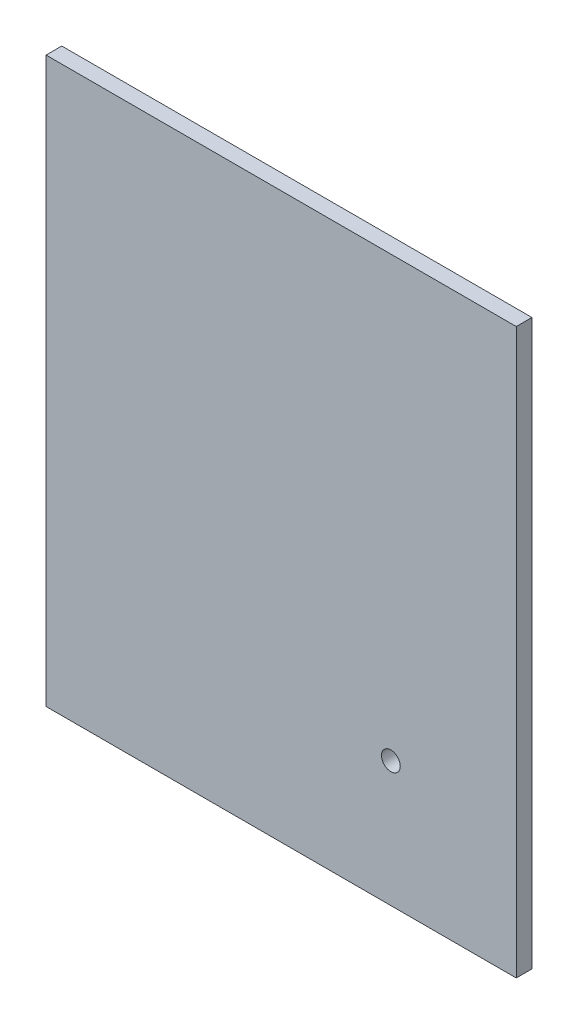
ISO-10303-21;
HEADER;
FILE_DESCRIPTION(('STEP AP214'),'2;1');
FILE_NAME('part.step','',(''),(''),'','','');
FILE_SCHEMA(('AUTOMOTIVE_DESIGN { 1 0 10303 214 1 1 1 1 }'));
ENDSEC;
DATA;
#1=APPLICATION_CONTEXT('core data for automotive mechanical design processes');
#2=APPLICATION_PROTOCOL_DEFINITION('international standard','automotive_design',2000,#1);
#3=PRODUCT_CONTEXT('',#1,'mechanical');
#4=PRODUCT('Part','Part','',(#3));
#5=PRODUCT_RELATED_PRODUCT_CATEGORY('part','',(#4));
#6=PRODUCT_DEFINITION_FORMATION('','',#4);
#7=PRODUCT_DEFINITION_CONTEXT('part definition',#1,'design');
#8=PRODUCT_DEFINITION('design','',#6,#7);
#9=PRODUCT_DEFINITION_SHAPE('','',#8);
#10=(LENGTH_UNIT() NAMED_UNIT(*) SI_UNIT(.MILLI.,.METRE.));
#11=(NAMED_UNIT(*) PLANE_ANGLE_UNIT() SI_UNIT($,.RADIAN.));
#12=(NAMED_UNIT(*) SI_UNIT($,.STERADIAN.) SOLID_ANGLE_UNIT());
#13=UNCERTAINTY_MEASURE_WITH_UNIT(LENGTH_MEASURE(1.E-05),#10,'distance_accuracy_value','');
#14=(GEOMETRIC_REPRESENTATION_CONTEXT(3) GLOBAL_UNCERTAINTY_ASSIGNED_CONTEXT((#13)) GLOBAL_UNIT_ASSIGNED_CONTEXT((#10,
#11,#12)) REPRESENTATION_CONTEXT('',''));
#15=CARTESIAN_POINT('',(0.,0.,0.));
#16=DIRECTION('',(0.,0.,1.));
#17=DIRECTION('',(1.,0.,0.));
#18=AXIS2_PLACEMENT_3D('',#15,#16,#17);
#19=CARTESIAN_POINT('',(0.,-90.,5.));
#20=DIRECTION('',(0.,-1.,0.));
#21=DIRECTION('',(1.,0.,0.));
#22=AXIS2_PLACEMENT_3D('',#19,#20,#21);
#23=PLANE('',#22);
#24=DIRECTION('',(-1.,0.,0.));
#25=VECTOR('',#24,1.);
#26=CARTESIAN_POINT('',(0.,-90.,0.));
#27=LINE('',#26,#25);
#28=CARTESIAN_POINT('',(75.,-90.,0.));
#29=VERTEX_POINT('',#28);
#30=CARTESIAN_POINT('',(-75.,-90.,0.));
#31=VERTEX_POINT('',#30);
#32=EDGE_CURVE('E102',#29,#31,#27,.T.);
#33=ORIENTED_EDGE('',*,*,#32,.F.);
#34=DIRECTION('',(0.,0.,-1.));
#35=VECTOR('',#34,1.);
#36=CARTESIAN_POINT('',(75.,-90.,5.));
#37=LINE('',#36,#35);
#38=CARTESIAN_POINT('',(75.,-90.,5.));
#39=VERTEX_POINT('',#38);
#40=EDGE_CURVE('E11',#39,#29,#37,.T.);
#41=ORIENTED_EDGE('',*,*,#40,.F.);
#42=DIRECTION('',(-1.,0.,0.));
#43=VECTOR('',#42,1.);
#44=CARTESIAN_POINT('',(0.,-90.,5.));
#45=LINE('',#44,#43);
#46=CARTESIAN_POINT('',(-75.,-90.,5.));
#47=VERTEX_POINT('',#46);
#48=EDGE_CURVE('E84',#39,#47,#45,.T.);
#49=ORIENTED_EDGE('',*,*,#48,.T.);
#50=DIRECTION('',(0.,0.,-1.));
#51=VECTOR('',#50,1.);
#52=CARTESIAN_POINT('',(-75.,-90.,5.));
#53=LINE('',#52,#51);
#54=EDGE_CURVE('E51',#47,#31,#53,.T.);
#55=ORIENTED_EDGE('',*,*,#54,.T.);
#56=EDGE_LOOP('',(#33,#41,#49,#55));
#57=FACE_BOUND('',#56,.T.);
#58=ADVANCED_FACE('F35',(#57),#23,.T.);
#59=CARTESIAN_POINT('',(75.,0.,5.));
#60=DIRECTION('',(-1.,0.,0.));
#61=DIRECTION('',(0.,0.,1.));
#62=AXIS2_PLACEMENT_3D('',#59,#60,#61);
#63=PLANE('',#62);
#64=DIRECTION('',(0.,1.,0.));
#65=VECTOR('',#64,1.);
#66=CARTESIAN_POINT('',(75.,0.,0.));
#67=LINE('',#66,#65);
#68=CARTESIAN_POINT('',(75.,90.,0.));
#69=VERTEX_POINT('',#68);
#70=EDGE_CURVE('E90',#29,#69,#67,.T.);
#71=ORIENTED_EDGE('',*,*,#70,.T.);
#72=DIRECTION('',(0.,0.,-1.));
#73=VECTOR('',#72,1.);
#74=CARTESIAN_POINT('',(75.,90.,5.));
#75=LINE('',#74,#73);
#76=CARTESIAN_POINT('',(75.,90.,5.));
#77=VERTEX_POINT('',#76);
#78=EDGE_CURVE('E43',#77,#69,#75,.T.);
#79=ORIENTED_EDGE('',*,*,#78,.F.);
#80=DIRECTION('',(0.,1.,0.));
#81=VECTOR('',#80,1.);
#82=CARTESIAN_POINT('',(75.,0.,5.));
#83=LINE('',#82,#81);
#84=EDGE_CURVE('E77',#39,#77,#83,.T.);
#85=ORIENTED_EDGE('',*,*,#84,.F.);
#86=ORIENTED_EDGE('',*,*,#40,.T.);
#87=EDGE_LOOP('',(#71,#79,#85,#86));
#88=FACE_BOUND('',#87,.T.);
#89=ADVANCED_FACE('F88',(#88),#63,.F.);
#90=CARTESIAN_POINT('',(0.,90.,5.));
#91=DIRECTION('',(0.,-1.,0.));
#92=DIRECTION('',(1.,0.,0.));
#93=AXIS2_PLACEMENT_3D('',#90,#91,#92);
#94=PLANE('',#93);
#95=DIRECTION('',(-1.,0.,0.));
#96=VECTOR('',#95,1.);
#97=CARTESIAN_POINT('',(0.,90.,0.));
#98=LINE('',#97,#96);
#99=CARTESIAN_POINT('',(-75.,90.,0.));
#100=VERTEX_POINT('',#99);
#101=EDGE_CURVE('E105',#69,#100,#98,.T.);
#102=ORIENTED_EDGE('',*,*,#101,.T.);
#103=DIRECTION('',(0.,0.,-1.));
#104=VECTOR('',#103,1.);
#105=CARTESIAN_POINT('',(-75.,90.,5.));
#106=LINE('',#105,#104);
#107=CARTESIAN_POINT('',(-75.,90.,5.));
#108=VERTEX_POINT('',#107);
#109=EDGE_CURVE('E65',#108,#100,#106,.T.);
#110=ORIENTED_EDGE('',*,*,#109,.F.);
#111=DIRECTION('',(-1.,0.,0.));
#112=VECTOR('',#111,1.);
#113=CARTESIAN_POINT('',(0.,90.,5.));
#114=LINE('',#113,#112);
#115=EDGE_CURVE('E83',#77,#108,#114,.T.);
#116=ORIENTED_EDGE('',*,*,#115,.F.);
#117=ORIENTED_EDGE('',*,*,#78,.T.);
#118=EDGE_LOOP('',(#102,#110,#116,#117));
#119=FACE_BOUND('',#118,.T.);
#120=ADVANCED_FACE('F93',(#119),#94,.F.);
#121=CARTESIAN_POINT('',(-75.,0.,5.));
#122=DIRECTION('',(-1.,0.,0.));
#123=DIRECTION('',(0.,0.,1.));
#124=AXIS2_PLACEMENT_3D('',#121,#122,#123);
#125=PLANE('',#124);
#126=DIRECTION('',(0.,1.,0.));
#127=VECTOR('',#126,1.);
#128=CARTESIAN_POINT('',(-75.,0.,0.));
#129=LINE('',#128,#127);
#130=EDGE_CURVE('E107',#31,#100,#129,.T.);
#131=ORIENTED_EDGE('',*,*,#130,.F.);
#132=ORIENTED_EDGE('',*,*,#54,.F.);
#133=DIRECTION('',(0.,1.,0.));
#134=VECTOR('',#133,1.);
#135=CARTESIAN_POINT('',(-75.,0.,5.));
#136=LINE('',#135,#134);
#137=EDGE_CURVE('E94',#47,#108,#136,.T.);
#138=ORIENTED_EDGE('',*,*,#137,.T.);
#139=ORIENTED_EDGE('',*,*,#109,.T.);
#140=EDGE_LOOP('',(#131,#132,#138,#139));
#141=FACE_BOUND('',#140,.T.);
#142=ADVANCED_FACE('F116',(#141),#125,.T.);
#143=CARTESIAN_POINT('',(35.,-50.,5.));
#144=DIRECTION('',(0.,0.,-1.));
#145=DIRECTION('',(-1.,0.,0.));
#146=AXIS2_PLACEMENT_3D('',#143,#144,#145);
#147=CYLINDRICAL_SURFACE('',#146,3.);
#148=CARTESIAN_POINT('',(35.,-50.,5.));
#149=DIRECTION('',(0.,0.,1.));
#150=DIRECTION('',(1.,0.,0.));
#151=AXIS2_PLACEMENT_3D('',#148,#149,#150);
#152=CIRCLE('',#151,3.);
#153=CARTESIAN_POINT('',(38.,-50.,5.));
#154=VERTEX_POINT('',#153);
#155=EDGE_CURVE('E96',#154,#154,#152,.T.);
#156=ORIENTED_EDGE('',*,*,#155,.T.);
#157=EDGE_LOOP('',(#156));
#158=FACE_BOUND('',#157,.T.);
#159=CARTESIAN_POINT('',(35.,-50.,0.));
#160=DIRECTION('',(0.,0.,1.));
#161=DIRECTION('',(1.,0.,0.));
#162=AXIS2_PLACEMENT_3D('',#159,#160,#161);
#163=CIRCLE('',#162,3.);
#164=CARTESIAN_POINT('',(38.,-50.,0.));
#165=VERTEX_POINT('',#164);
#166=EDGE_CURVE('E110',#165,#165,#163,.T.);
#167=ORIENTED_EDGE('',*,*,#166,.F.);
#168=EDGE_LOOP('',(#167));
#169=FACE_BOUND('',#168,.T.);
#170=ADVANCED_FACE('F118',(#158,#169),#147,.F.);
#171=CARTESIAN_POINT('',(0.,0.,5.));
#172=DIRECTION('',(0.,0.,1.));
#173=DIRECTION('',(1.,0.,0.));
#174=AXIS2_PLACEMENT_3D('',#171,#172,#173);
#175=PLANE('',#174);
#176=ORIENTED_EDGE('',*,*,#48,.F.);
#177=ORIENTED_EDGE('',*,*,#84,.T.);
#178=ORIENTED_EDGE('',*,*,#115,.T.);
#179=ORIENTED_EDGE('',*,*,#137,.F.);
#180=EDGE_LOOP('',(#176,#177,#178,#179));
#181=FACE_BOUND('',#180,.T.);
#182=ORIENTED_EDGE('',*,*,#155,.F.);
#183=EDGE_LOOP('',(#182));
#184=FACE_BOUND('',#183,.T.);
#185=ADVANCED_FACE('F79',(#181,#184),#175,.T.);
#186=CARTESIAN_POINT('',(0.,0.,0.));
#187=DIRECTION('',(0.,0.,1.));
#188=DIRECTION('',(1.,0.,0.));
#189=AXIS2_PLACEMENT_3D('',#186,#187,#188);
#190=PLANE('',#189);
#191=ORIENTED_EDGE('',*,*,#32,.T.);
#192=ORIENTED_EDGE('',*,*,#130,.T.);
#193=ORIENTED_EDGE('',*,*,#101,.F.);
#194=ORIENTED_EDGE('',*,*,#70,.F.);
#195=EDGE_LOOP('',(#191,#192,#193,#194));
#196=FACE_BOUND('',#195,.T.);
#197=ORIENTED_EDGE('',*,*,#166,.T.);
#198=EDGE_LOOP('',(#197));
#199=FACE_BOUND('',#198,.T.);
#200=ADVANCED_FACE('F157',(#196,#199),#190,.F.);
#201=CLOSED_SHELL('',(#58,#89,#120,#142,#170,#185,#200));
#202=MANIFOLD_SOLID_BREP('B2',#201);
#203=ADVANCED_BREP_SHAPE_REPRESENTATION('',(#18,#202),#14);
#204=SHAPE_DEFINITION_REPRESENTATION(#9,#203);
ENDSEC;
END-ISO-10303-21;
